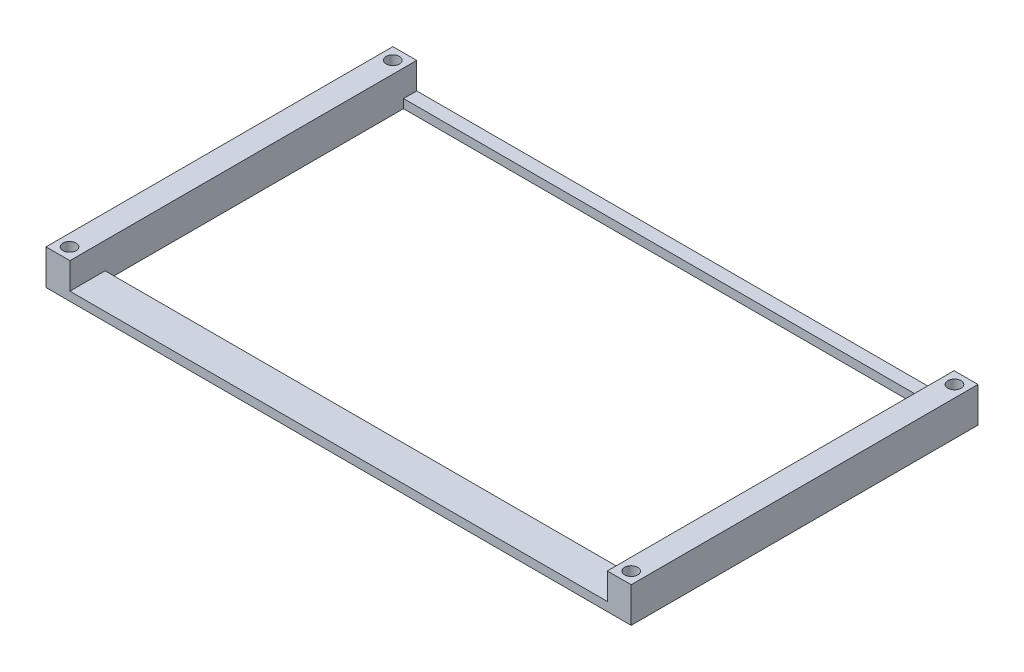
ISO-10303-21;
HEADER;
FILE_DESCRIPTION(('STEP AP214'),'2;1');
FILE_NAME('part.step','',(''),(''),'','','');
FILE_SCHEMA(('AUTOMOTIVE_DESIGN { 1 0 10303 214 1 1 1 1 }'));
ENDSEC;
DATA;
#1=APPLICATION_CONTEXT('core data for automotive mechanical design processes');
#2=APPLICATION_PROTOCOL_DEFINITION('international standard','automotive_design',2000,#1);
#3=PRODUCT_CONTEXT('',#1,'mechanical');
#4=PRODUCT('Part','Part','',(#3));
#5=PRODUCT_RELATED_PRODUCT_CATEGORY('part','',(#4));
#6=PRODUCT_DEFINITION_FORMATION('','',#4);
#7=PRODUCT_DEFINITION_CONTEXT('part definition',#1,'design');
#8=PRODUCT_DEFINITION('design','',#6,#7);
#9=PRODUCT_DEFINITION_SHAPE('','',#8);
#10=(LENGTH_UNIT() NAMED_UNIT(*) SI_UNIT(.MILLI.,.METRE.));
#11=(NAMED_UNIT(*) PLANE_ANGLE_UNIT() SI_UNIT($,.RADIAN.));
#12=(NAMED_UNIT(*) SI_UNIT($,.STERADIAN.) SOLID_ANGLE_UNIT());
#13=UNCERTAINTY_MEASURE_WITH_UNIT(LENGTH_MEASURE(1.E-05),#10,'distance_accuracy_value','');
#14=(GEOMETRIC_REPRESENTATION_CONTEXT(3) GLOBAL_UNCERTAINTY_ASSIGNED_CONTEXT((#13)) GLOBAL_UNIT_ASSIGNED_CONTEXT((#10,
#11,#12)) REPRESENTATION_CONTEXT('',''));
#15=CARTESIAN_POINT('',(0.,0.,0.));
#16=DIRECTION('',(0.,0.,1.));
#17=DIRECTION('',(1.,0.,0.));
#18=AXIS2_PLACEMENT_3D('',#15,#16,#17);
#19=CARTESIAN_POINT('',(0.,2.,0.));
#20=DIRECTION('',(0.,1.,0.));
#21=DIRECTION('',(0.,0.,1.));
#22=AXIS2_PLACEMENT_3D('',#19,#20,#21);
#23=PLANE('',#22);
#24=DIRECTION('',(0.,0.,1.));
#25=VECTOR('',#24,1.);
#26=CARTESIAN_POINT('',(61.,2.,0.));
#27=LINE('',#26,#25);
#28=CARTESIAN_POINT('',(61.,2.,-39.37));
#29=VERTEX_POINT('',#28);
#30=CARTESIAN_POINT('',(61.,2.,-36.37));
#31=VERTEX_POINT('',#30);
#32=EDGE_CURVE('E163',#29,#31,#27,.T.);
#33=ORIENTED_EDGE('',*,*,#32,.F.);
#34=DIRECTION('',(1.,0.,0.));
#35=VECTOR('',#34,1.);
#36=CARTESIAN_POINT('',(0.,2.,-39.37));
#37=LINE('',#36,#35);
#38=CARTESIAN_POINT('',(-61.,2.,-39.37));
#39=VERTEX_POINT('',#38);
#40=EDGE_CURVE('E190',#39,#29,#37,.T.);
#41=ORIENTED_EDGE('',*,*,#40,.F.);
#42=DIRECTION('',(0.,0.,1.));
#43=VECTOR('',#42,1.);
#44=CARTESIAN_POINT('',(-61.,2.,0.));
#45=LINE('',#44,#43);
#46=CARTESIAN_POINT('',(-61.,2.,-36.37));
#47=VERTEX_POINT('',#46);
#48=EDGE_CURVE('E189',#39,#47,#45,.T.);
#49=ORIENTED_EDGE('',*,*,#48,.T.);
#50=DIRECTION('',(1.,0.,0.));
#51=VECTOR('',#50,1.);
#52=CARTESIAN_POINT('',(0.,2.,-36.37));
#53=LINE('',#52,#51);
#54=EDGE_CURVE('E196',#47,#31,#53,.T.);
#55=ORIENTED_EDGE('',*,*,#54,.T.);
#56=EDGE_LOOP('',(#33,#41,#49,#55));
#57=FACE_BOUND('',#56,.T.);
#58=ADVANCED_FACE('F34',(#57),#23,.T.);
#59=CARTESIAN_POINT('',(61.,2.,31.37));
#60=VERTEX_POINT('',#59);
#61=CARTESIAN_POINT('',(61.,2.,39.37));
#62=VERTEX_POINT('',#61);
#63=EDGE_CURVE('E131',#60,#62,#27,.T.);
#64=ORIENTED_EDGE('',*,*,#63,.F.);
#65=DIRECTION('',(1.,0.,0.));
#66=VECTOR('',#65,1.);
#67=CARTESIAN_POINT('',(0.,2.,31.37));
#68=LINE('',#67,#66);
#69=CARTESIAN_POINT('',(-61.,2.,31.37));
#70=VERTEX_POINT('',#69);
#71=EDGE_CURVE('E199',#70,#60,#68,.T.);
#72=ORIENTED_EDGE('',*,*,#71,.F.);
#73=CARTESIAN_POINT('',(-61.,2.,39.37));
#74=VERTEX_POINT('',#73);
#75=EDGE_CURVE('E186',#70,#74,#45,.T.);
#76=ORIENTED_EDGE('',*,*,#75,.T.);
#77=DIRECTION('',(1.,0.,0.));
#78=VECTOR('',#77,1.);
#79=CARTESIAN_POINT('',(0.,2.,39.37));
#80=LINE('',#79,#78);
#81=EDGE_CURVE('E193',#74,#62,#80,.T.);
#82=ORIENTED_EDGE('',*,*,#81,.T.);
#83=EDGE_LOOP('',(#64,#72,#76,#82));
#84=FACE_BOUND('',#83,.T.);
#85=ADVANCED_FACE('F275',(#84),#23,.T.);
#86=CARTESIAN_POINT('',(0.,2.,-36.37));
#87=DIRECTION('',(0.,0.,-1.));
#88=DIRECTION('',(-1.,0.,0.));
#89=AXIS2_PLACEMENT_3D('',#86,#87,#88);
#90=PLANE('',#89);
#91=DIRECTION('',(1.,0.,0.));
#92=VECTOR('',#91,1.);
#93=CARTESIAN_POINT('',(0.,0.,-36.37));
#94=LINE('',#93,#92);
#95=CARTESIAN_POINT('',(-61.,0.,-36.37));
#96=VERTEX_POINT('',#95);
#97=CARTESIAN_POINT('',(61.,0.,-36.37));
#98=VERTEX_POINT('',#97);
#99=EDGE_CURVE('E212',#96,#98,#94,.T.);
#100=ORIENTED_EDGE('',*,*,#99,.T.);
#101=DIRECTION('',(0.,-1.,0.));
#102=VECTOR('',#101,1.);
#103=CARTESIAN_POINT('',(61.,2.,-36.37));
#104=LINE('',#103,#102);
#105=EDGE_CURVE('E11',#31,#98,#104,.T.);
#106=ORIENTED_EDGE('',*,*,#105,.F.);
#107=ORIENTED_EDGE('',*,*,#54,.F.);
#108=DIRECTION('',(0.,-1.,0.));
#109=VECTOR('',#108,1.);
#110=CARTESIAN_POINT('',(-61.,2.,-36.37));
#111=LINE('',#110,#109);
#112=EDGE_CURVE('E233',#47,#96,#111,.T.);
#113=ORIENTED_EDGE('',*,*,#112,.T.);
#114=EDGE_LOOP('',(#100,#106,#107,#113));
#115=FACE_BOUND('',#114,.T.);
#116=ADVANCED_FACE('F268',(#115),#90,.F.);
#117=CARTESIAN_POINT('',(61.,2.,0.));
#118=DIRECTION('',(-1.,0.,0.));
#119=DIRECTION('',(0.,0.,1.));
#120=AXIS2_PLACEMENT_3D('',#117,#118,#119);
#121=PLANE('',#120);
#122=DIRECTION('',(0.,0.,-1.));
#123=VECTOR('',#122,1.);
#124=CARTESIAN_POINT('',(61.,0.,0.));
#125=LINE('',#124,#123);
#126=CARTESIAN_POINT('',(61.,0.,31.37));
#127=VERTEX_POINT('',#126);
#128=EDGE_CURVE('E215',#127,#98,#125,.T.);
#129=ORIENTED_EDGE('',*,*,#128,.F.);
#130=DIRECTION('',(0.,-1.,0.));
#131=VECTOR('',#130,1.);
#132=CARTESIAN_POINT('',(61.,2.,31.37));
#133=LINE('',#132,#131);
#134=EDGE_CURVE('E43',#60,#127,#133,.T.);
#135=ORIENTED_EDGE('',*,*,#134,.F.);
#136=ORIENTED_EDGE('',*,*,#63,.T.);
#137=DIRECTION('',(0.,-1.,0.));
#138=VECTOR('',#137,1.);
#139=CARTESIAN_POINT('',(61.,8.,39.37));
#140=LINE('',#139,#138);
#141=CARTESIAN_POINT('',(61.,8.,39.37));
#142=VERTEX_POINT('',#141);
#143=EDGE_CURVE('E123',#142,#62,#140,.T.);
#144=ORIENTED_EDGE('',*,*,#143,.F.);
#145=DIRECTION('',(0.,0.,-1.));
#146=VECTOR('',#145,1.);
#147=CARTESIAN_POINT('',(61.,8.,0.));
#148=LINE('',#147,#146);
#149=CARTESIAN_POINT('',(61.,8.,-39.37));
#150=VERTEX_POINT('',#149);
#151=EDGE_CURVE('E128',#142,#150,#148,.T.);
#152=ORIENTED_EDGE('',*,*,#151,.T.);
#153=DIRECTION('',(0.,-1.,0.));
#154=VECTOR('',#153,1.);
#155=CARTESIAN_POINT('',(61.,8.,-39.37));
#156=LINE('',#155,#154);
#157=EDGE_CURVE('E135',#150,#29,#156,.T.);
#158=ORIENTED_EDGE('',*,*,#157,.T.);
#159=ORIENTED_EDGE('',*,*,#32,.T.);
#160=ORIENTED_EDGE('',*,*,#105,.T.);
#161=EDGE_LOOP('',(#129,#135,#136,#144,#152,#158,#159,#160));
#162=FACE_BOUND('',#161,.T.);
#163=ADVANCED_FACE('F126',(#162),#121,.T.);
#164=CARTESIAN_POINT('',(0.,2.,31.37));
#165=DIRECTION('',(0.,0.,-1.));
#166=DIRECTION('',(-1.,0.,0.));
#167=AXIS2_PLACEMENT_3D('',#164,#165,#166);
#168=PLANE('',#167);
#169=DIRECTION('',(1.,0.,0.));
#170=VECTOR('',#169,1.);
#171=CARTESIAN_POINT('',(0.,0.,31.37));
#172=LINE('',#171,#170);
#173=CARTESIAN_POINT('',(-61.,0.,31.37));
#174=VERTEX_POINT('',#173);
#175=EDGE_CURVE('E218',#174,#127,#172,.T.);
#176=ORIENTED_EDGE('',*,*,#175,.F.);
#177=DIRECTION('',(0.,-1.,0.));
#178=VECTOR('',#177,1.);
#179=CARTESIAN_POINT('',(-61.,2.,31.37));
#180=LINE('',#179,#178);
#181=EDGE_CURVE('E56',#70,#174,#180,.T.);
#182=ORIENTED_EDGE('',*,*,#181,.F.);
#183=ORIENTED_EDGE('',*,*,#71,.T.);
#184=ORIENTED_EDGE('',*,*,#134,.T.);
#185=EDGE_LOOP('',(#176,#182,#183,#184));
#186=FACE_BOUND('',#185,.T.);
#187=ADVANCED_FACE('F272',(#186),#168,.T.);
#188=CARTESIAN_POINT('',(66.42,2.,0.));
#189=DIRECTION('',(-1.,0.,0.));
#190=DIRECTION('',(0.,0.,1.));
#191=AXIS2_PLACEMENT_3D('',#188,#189,#190);
#192=PLANE('',#191);
#193=DIRECTION('',(0.,0.,-1.));
#194=VECTOR('',#193,1.);
#195=CARTESIAN_POINT('',(66.42,0.,0.));
#196=LINE('',#195,#194);
#197=CARTESIAN_POINT('',(66.42,0.,39.37));
#198=VERTEX_POINT('',#197);
#199=CARTESIAN_POINT('',(66.42,0.,-39.37));
#200=VERTEX_POINT('',#199);
#201=EDGE_CURVE('E202',#198,#200,#196,.T.);
#202=ORIENTED_EDGE('',*,*,#201,.T.);
#203=DIRECTION('',(0.,-1.,0.));
#204=VECTOR('',#203,1.);
#205=CARTESIAN_POINT('',(66.42,2.,-39.37));
#206=LINE('',#205,#204);
#207=CARTESIAN_POINT('',(66.42,8.,-39.37));
#208=VERTEX_POINT('',#207);
#209=EDGE_CURVE('E38',#208,#200,#206,.T.);
#210=ORIENTED_EDGE('',*,*,#209,.F.);
#211=DIRECTION('',(0.,0.,-1.));
#212=VECTOR('',#211,1.);
#213=CARTESIAN_POINT('',(66.42,8.,0.));
#214=LINE('',#213,#212);
#215=CARTESIAN_POINT('',(66.42,8.,39.37));
#216=VERTEX_POINT('',#215);
#217=EDGE_CURVE('E145',#216,#208,#214,.T.);
#218=ORIENTED_EDGE('',*,*,#217,.F.);
#219=DIRECTION('',(0.,-1.,0.));
#220=VECTOR('',#219,1.);
#221=CARTESIAN_POINT('',(66.42,2.,39.37));
#222=LINE('',#221,#220);
#223=EDGE_CURVE('E141',#216,#198,#222,.T.);
#224=ORIENTED_EDGE('',*,*,#223,.T.);
#225=EDGE_LOOP('',(#202,#210,#218,#224));
#226=FACE_BOUND('',#225,.T.);
#227=ADVANCED_FACE('F36',(#226),#192,.F.);
#228=CARTESIAN_POINT('',(0.,2.,-39.37));
#229=DIRECTION('',(0.,0.,-1.));
#230=DIRECTION('',(-1.,0.,0.));
#231=AXIS2_PLACEMENT_3D('',#228,#229,#230);
#232=PLANE('',#231);
#233=ORIENTED_EDGE('',*,*,#40,.T.);
#234=ORIENTED_EDGE('',*,*,#157,.F.);
#235=DIRECTION('',(1.,0.,0.));
#236=VECTOR('',#235,1.);
#237=CARTESIAN_POINT('',(0.,8.,-39.37));
#238=LINE('',#237,#236);
#239=EDGE_CURVE('E150',#150,#208,#238,.T.);
#240=ORIENTED_EDGE('',*,*,#239,.T.);
#241=ORIENTED_EDGE('',*,*,#209,.T.);
#242=DIRECTION('',(1.,0.,0.));
#243=VECTOR('',#242,1.);
#244=CARTESIAN_POINT('',(0.,0.,-39.37));
#245=LINE('',#244,#243);
#246=CARTESIAN_POINT('',(-66.42,0.,-39.37));
#247=VERTEX_POINT('',#246);
#248=EDGE_CURVE('E205',#247,#200,#245,.T.);
#249=ORIENTED_EDGE('',*,*,#248,.F.);
#250=DIRECTION('',(0.,-1.,0.));
#251=VECTOR('',#250,1.);
#252=CARTESIAN_POINT('',(-66.42,2.,-39.37));
#253=LINE('',#252,#251);
#254=CARTESIAN_POINT('',(-66.42,8.,-39.37));
#255=VERTEX_POINT('',#254);
#256=EDGE_CURVE('E239',#255,#247,#253,.T.);
#257=ORIENTED_EDGE('',*,*,#256,.F.);
#258=DIRECTION('',(1.,0.,0.));
#259=VECTOR('',#258,1.);
#260=CARTESIAN_POINT('',(0.,8.,-39.37));
#261=LINE('',#260,#259);
#262=CARTESIAN_POINT('',(-61.,8.,-39.37));
#263=VERTEX_POINT('',#262);
#264=EDGE_CURVE('E169',#255,#263,#261,.T.);
#265=ORIENTED_EDGE('',*,*,#264,.T.);
#266=DIRECTION('',(0.,-1.,0.));
#267=VECTOR('',#266,1.);
#268=CARTESIAN_POINT('',(-61.,8.,-39.37));
#269=LINE('',#268,#267);
#270=EDGE_CURVE('E181',#263,#39,#269,.T.);
#271=ORIENTED_EDGE('',*,*,#270,.T.);
#272=EDGE_LOOP('',(#233,#234,#240,#241,#249,#257,#265,#271));
#273=FACE_BOUND('',#272,.T.);
#274=ADVANCED_FACE('F245',(#273),#232,.T.);
#275=CARTESIAN_POINT('',(-66.42,2.,0.));
#276=DIRECTION('',(-1.,0.,0.));
#277=DIRECTION('',(0.,0.,1.));
#278=AXIS2_PLACEMENT_3D('',#275,#276,#277);
#279=PLANE('',#278);
#280=DIRECTION('',(0.,0.,-1.));
#281=VECTOR('',#280,1.);
#282=CARTESIAN_POINT('',(-66.42,0.,0.));
#283=LINE('',#282,#281);
#284=CARTESIAN_POINT('',(-66.42,0.,39.37));
#285=VERTEX_POINT('',#284);
#286=EDGE_CURVE('E207',#285,#247,#283,.T.);
#287=ORIENTED_EDGE('',*,*,#286,.F.);
#288=DIRECTION('',(0.,-1.,0.));
#289=VECTOR('',#288,1.);
#290=CARTESIAN_POINT('',(-66.42,2.,39.37));
#291=LINE('',#290,#289);
#292=CARTESIAN_POINT('',(-66.42,8.,39.37));
#293=VERTEX_POINT('',#292);
#294=EDGE_CURVE('E238',#293,#285,#291,.T.);
#295=ORIENTED_EDGE('',*,*,#294,.F.);
#296=DIRECTION('',(0.,0.,-1.));
#297=VECTOR('',#296,1.);
#298=CARTESIAN_POINT('',(-66.42,8.,0.));
#299=LINE('',#298,#297);
#300=EDGE_CURVE('E172',#293,#255,#299,.T.);
#301=ORIENTED_EDGE('',*,*,#300,.T.);
#302=ORIENTED_EDGE('',*,*,#256,.T.);
#303=EDGE_LOOP('',(#287,#295,#301,#302));
#304=FACE_BOUND('',#303,.T.);
#305=ADVANCED_FACE('F252',(#304),#279,.T.);
#306=CARTESIAN_POINT('',(63.75,2.,36.7));
#307=DIRECTION('',(0.,-1.,0.));
#308=DIRECTION('',(0.,0.,-1.));
#309=AXIS2_PLACEMENT_3D('',#306,#307,#308);
#310=CYLINDRICAL_SURFACE('',#309,1.50000000000001);
#311=CARTESIAN_POINT('',(63.75,0.,36.7));
#312=DIRECTION('',(0.,1.,0.));
#313=DIRECTION('',(0.,0.,1.));
#314=AXIS2_PLACEMENT_3D('',#311,#312,#313);
#315=CIRCLE('',#314,1.50000000000001);
#316=CARTESIAN_POINT('',(63.75,0.,38.2));
#317=VERTEX_POINT('',#316);
#318=EDGE_CURVE('E228',#317,#317,#315,.T.);
#319=ORIENTED_EDGE('',*,*,#318,.F.);
#320=EDGE_LOOP('',(#319));
#321=FACE_BOUND('',#320,.T.);
#322=CARTESIAN_POINT('',(63.75,8.,36.7));
#323=DIRECTION('',(0.,1.,0.));
#324=DIRECTION('',(0.,0.,1.));
#325=AXIS2_PLACEMENT_3D('',#322,#323,#324);
#326=CIRCLE('',#325,1.50000000000001);
#327=CARTESIAN_POINT('',(63.75,8.,38.2));
#328=VERTEX_POINT('',#327);
#329=EDGE_CURVE('E151',#328,#328,#326,.T.);
#330=ORIENTED_EDGE('',*,*,#329,.T.);
#331=EDGE_LOOP('',(#330));
#332=FACE_BOUND('',#331,.T.);
#333=ADVANCED_FACE('F303',(#321,#332),#310,.F.);
#334=CARTESIAN_POINT('',(-63.75,2.,36.7));
#335=DIRECTION('',(0.,-1.,0.));
#336=DIRECTION('',(0.,0.,-1.));
#337=AXIS2_PLACEMENT_3D('',#334,#335,#336);
#338=CYLINDRICAL_SURFACE('',#337,1.50000000000001);
#339=CARTESIAN_POINT('',(-63.75,0.,36.7));
#340=DIRECTION('',(0.,1.,0.));
#341=DIRECTION('',(0.,0.,1.));
#342=AXIS2_PLACEMENT_3D('',#339,#340,#341);
#343=CIRCLE('',#342,1.50000000000001);
#344=CARTESIAN_POINT('',(-63.75,0.,38.2));
#345=VERTEX_POINT('',#344);
#346=EDGE_CURVE('E225',#345,#345,#343,.F.);
#347=ORIENTED_EDGE('',*,*,#346,.T.);
#348=EDGE_LOOP('',(#347));
#349=FACE_BOUND('',#348,.T.);
#350=CARTESIAN_POINT('',(-63.75,8.,36.7));
#351=DIRECTION('',(0.,1.,0.));
#352=DIRECTION('',(0.,0.,1.));
#353=AXIS2_PLACEMENT_3D('',#350,#351,#352);
#354=CIRCLE('',#353,1.50000000000001);
#355=CARTESIAN_POINT('',(-63.75,8.,38.2));
#356=VERTEX_POINT('',#355);
#357=EDGE_CURVE('E178',#356,#356,#354,.F.);
#358=ORIENTED_EDGE('',*,*,#357,.F.);
#359=EDGE_LOOP('',(#358));
#360=FACE_BOUND('',#359,.T.);
#361=ADVANCED_FACE('F286',(#349,#360),#338,.F.);
#362=CARTESIAN_POINT('',(-63.75,2.,-36.7));
#363=DIRECTION('',(0.,-1.,0.));
#364=DIRECTION('',(0.,0.,-1.));
#365=AXIS2_PLACEMENT_3D('',#362,#363,#364);
#366=CYLINDRICAL_SURFACE('',#365,1.50000000000002);
#367=CARTESIAN_POINT('',(-63.75,0.,-36.7));
#368=DIRECTION('',(0.,1.,0.));
#369=DIRECTION('',(0.,0.,1.));
#370=AXIS2_PLACEMENT_3D('',#367,#368,#369);
#371=CIRCLE('',#370,1.50000000000002);
#372=CARTESIAN_POINT('',(-63.75,0.,-35.2));
#373=VERTEX_POINT('',#372);
#374=EDGE_CURVE('E222',#373,#373,#371,.T.);
#375=ORIENTED_EDGE('',*,*,#374,.F.);
#376=EDGE_LOOP('',(#375));
#377=FACE_BOUND('',#376,.T.);
#378=CARTESIAN_POINT('',(-63.75,8.,-36.7));
#379=DIRECTION('',(0.,1.,0.));
#380=DIRECTION('',(0.,0.,1.));
#381=AXIS2_PLACEMENT_3D('',#378,#379,#380);
#382=CIRCLE('',#381,1.50000000000002);
#383=CARTESIAN_POINT('',(-63.75,8.,-35.2));
#384=VERTEX_POINT('',#383);
#385=EDGE_CURVE('E175',#384,#384,#382,.T.);
#386=ORIENTED_EDGE('',*,*,#385,.T.);
#387=EDGE_LOOP('',(#386));
#388=FACE_BOUND('',#387,.T.);
#389=ADVANCED_FACE('F278',(#377,#388),#366,.F.);
#390=CARTESIAN_POINT('',(-61.,2.,0.));
#391=DIRECTION('',(-1.,0.,0.));
#392=DIRECTION('',(0.,0.,1.));
#393=AXIS2_PLACEMENT_3D('',#390,#391,#392);
#394=PLANE('',#393);
#395=DIRECTION('',(0.,0.,-1.));
#396=VECTOR('',#395,1.);
#397=CARTESIAN_POINT('',(-61.,0.,0.));
#398=LINE('',#397,#396);
#399=EDGE_CURVE('E51',#174,#96,#398,.T.);
#400=ORIENTED_EDGE('',*,*,#399,.T.);
#401=ORIENTED_EDGE('',*,*,#112,.F.);
#402=ORIENTED_EDGE('',*,*,#48,.F.);
#403=ORIENTED_EDGE('',*,*,#270,.F.);
#404=DIRECTION('',(0.,0.,-1.));
#405=VECTOR('',#404,1.);
#406=CARTESIAN_POINT('',(-61.,8.,0.));
#407=LINE('',#406,#405);
#408=CARTESIAN_POINT('',(-61.,8.,39.37));
#409=VERTEX_POINT('',#408);
#410=EDGE_CURVE('E167',#409,#263,#407,.T.);
#411=ORIENTED_EDGE('',*,*,#410,.F.);
#412=DIRECTION('',(0.,-1.,0.));
#413=VECTOR('',#412,1.);
#414=CARTESIAN_POINT('',(-61.,8.,39.37));
#415=LINE('',#414,#413);
#416=EDGE_CURVE('E184',#409,#74,#415,.T.);
#417=ORIENTED_EDGE('',*,*,#416,.T.);
#418=ORIENTED_EDGE('',*,*,#75,.F.);
#419=ORIENTED_EDGE('',*,*,#181,.T.);
#420=EDGE_LOOP('',(#400,#401,#402,#403,#411,#417,#418,#419));
#421=FACE_BOUND('',#420,.T.);
#422=ADVANCED_FACE('F276',(#421),#394,.F.);
#423=CARTESIAN_POINT('',(0.,2.,39.37));
#424=DIRECTION('',(0.,0.,-1.));
#425=DIRECTION('',(-1.,0.,0.));
#426=AXIS2_PLACEMENT_3D('',#423,#424,#425);
#427=PLANE('',#426);
#428=DIRECTION('',(1.,0.,0.));
#429=VECTOR('',#428,1.);
#430=CARTESIAN_POINT('',(0.,0.,39.37));
#431=LINE('',#430,#429);
#432=EDGE_CURVE('E210',#285,#198,#431,.T.);
#433=ORIENTED_EDGE('',*,*,#432,.T.);
#434=ORIENTED_EDGE('',*,*,#223,.F.);
#435=DIRECTION('',(1.,0.,0.));
#436=VECTOR('',#435,1.);
#437=CARTESIAN_POINT('',(0.,8.,39.37));
#438=LINE('',#437,#436);
#439=EDGE_CURVE('E138',#142,#216,#438,.T.);
#440=ORIENTED_EDGE('',*,*,#439,.F.);
#441=ORIENTED_EDGE('',*,*,#143,.T.);
#442=ORIENTED_EDGE('',*,*,#81,.F.);
#443=ORIENTED_EDGE('',*,*,#416,.F.);
#444=DIRECTION('',(1.,0.,0.));
#445=VECTOR('',#444,1.);
#446=CARTESIAN_POINT('',(0.,8.,39.37));
#447=LINE('',#446,#445);
#448=EDGE_CURVE('E164',#293,#409,#447,.T.);
#449=ORIENTED_EDGE('',*,*,#448,.F.);
#450=ORIENTED_EDGE('',*,*,#294,.T.);
#451=EDGE_LOOP('',(#433,#434,#440,#441,#442,#443,#449,#450));
#452=FACE_BOUND('',#451,.T.);
#453=ADVANCED_FACE('F139',(#452),#427,.F.);
#454=CARTESIAN_POINT('',(63.75,2.,-36.7));
#455=DIRECTION('',(0.,-1.,0.));
#456=DIRECTION('',(0.,0.,-1.));
#457=AXIS2_PLACEMENT_3D('',#454,#455,#456);
#458=CYLINDRICAL_SURFACE('',#457,1.50000000000001);
#459=CARTESIAN_POINT('',(63.75,0.,-36.7));
#460=DIRECTION('',(0.,1.,0.));
#461=DIRECTION('',(0.,0.,1.));
#462=AXIS2_PLACEMENT_3D('',#459,#460,#461);
#463=CIRCLE('',#462,1.50000000000001);
#464=CARTESIAN_POINT('',(63.75,0.,-35.2));
#465=VERTEX_POINT('',#464);
#466=EDGE_CURVE('E194',#465,#465,#463,.F.);
#467=ORIENTED_EDGE('',*,*,#466,.T.);
#468=EDGE_LOOP('',(#467));
#469=FACE_BOUND('',#468,.T.);
#470=CARTESIAN_POINT('',(63.75,8.,-36.7));
#471=DIRECTION('',(0.,1.,0.));
#472=DIRECTION('',(0.,0.,1.));
#473=AXIS2_PLACEMENT_3D('',#470,#471,#472);
#474=CIRCLE('',#473,1.50000000000001);
#475=CARTESIAN_POINT('',(63.75,8.,-35.2));
#476=VERTEX_POINT('',#475);
#477=EDGE_CURVE('E158',#476,#476,#474,.F.);
#478=ORIENTED_EDGE('',*,*,#477,.F.);
#479=EDGE_LOOP('',(#478));
#480=FACE_BOUND('',#479,.T.);
#481=ADVANCED_FACE('F284',(#469,#480),#458,.F.);
#482=CARTESIAN_POINT('',(0.,0.,0.));
#483=DIRECTION('',(0.,1.,0.));
#484=DIRECTION('',(0.,0.,1.));
#485=AXIS2_PLACEMENT_3D('',#482,#483,#484);
#486=PLANE('',#485);
#487=ORIENTED_EDGE('',*,*,#128,.T.);
#488=ORIENTED_EDGE('',*,*,#99,.F.);
#489=ORIENTED_EDGE('',*,*,#399,.F.);
#490=ORIENTED_EDGE('',*,*,#175,.T.);
#491=EDGE_LOOP('',(#487,#488,#489,#490));
#492=FACE_BOUND('',#491,.T.);
#493=ORIENTED_EDGE('',*,*,#248,.T.);
#494=ORIENTED_EDGE('',*,*,#201,.F.);
#495=ORIENTED_EDGE('',*,*,#432,.F.);
#496=ORIENTED_EDGE('',*,*,#286,.T.);
#497=EDGE_LOOP('',(#493,#494,#495,#496));
#498=FACE_BOUND('',#497,.T.);
#499=ORIENTED_EDGE('',*,*,#374,.T.);
#500=EDGE_LOOP('',(#499));
#501=FACE_BOUND('',#500,.T.);
#502=ORIENTED_EDGE('',*,*,#346,.F.);
#503=EDGE_LOOP('',(#502));
#504=FACE_BOUND('',#503,.T.);
#505=ORIENTED_EDGE('',*,*,#318,.T.);
#506=EDGE_LOOP('',(#505));
#507=FACE_BOUND('',#506,.T.);
#508=ORIENTED_EDGE('',*,*,#466,.F.);
#509=EDGE_LOOP('',(#508));
#510=FACE_BOUND('',#509,.T.);
#511=ADVANCED_FACE('F250',(#492,#498,#501,#504,#507,#510),#486,.F.);
#512=CARTESIAN_POINT('',(0.,8.,0.));
#513=DIRECTION('',(0.,1.,0.));
#514=DIRECTION('',(0.,0.,1.));
#515=AXIS2_PLACEMENT_3D('',#512,#513,#514);
#516=PLANE('',#515);
#517=ORIENTED_EDGE('',*,*,#448,.T.);
#518=ORIENTED_EDGE('',*,*,#410,.T.);
#519=ORIENTED_EDGE('',*,*,#264,.F.);
#520=ORIENTED_EDGE('',*,*,#300,.F.);
#521=EDGE_LOOP('',(#517,#518,#519,#520));
#522=FACE_BOUND('',#521,.T.);
#523=ORIENTED_EDGE('',*,*,#385,.F.);
#524=EDGE_LOOP('',(#523));
#525=FACE_BOUND('',#524,.T.);
#526=ORIENTED_EDGE('',*,*,#357,.T.);
#527=EDGE_LOOP('',(#526));
#528=FACE_BOUND('',#527,.T.);
#529=ADVANCED_FACE('F258',(#522,#525,#528),#516,.T.);
#530=CARTESIAN_POINT('',(0.,8.,0.));
#531=DIRECTION('',(0.,1.,0.));
#532=DIRECTION('',(0.,0.,1.));
#533=AXIS2_PLACEMENT_3D('',#530,#531,#532);
#534=PLANE('',#533);
#535=ORIENTED_EDGE('',*,*,#329,.F.);
#536=EDGE_LOOP('',(#535));
#537=FACE_BOUND('',#536,.T.);
#538=ORIENTED_EDGE('',*,*,#151,.F.);
#539=ORIENTED_EDGE('',*,*,#439,.T.);
#540=ORIENTED_EDGE('',*,*,#217,.T.);
#541=ORIENTED_EDGE('',*,*,#239,.F.);
#542=EDGE_LOOP('',(#538,#539,#540,#541));
#543=FACE_BOUND('',#542,.T.);
#544=ORIENTED_EDGE('',*,*,#477,.T.);
#545=EDGE_LOOP('',(#544));
#546=FACE_BOUND('',#545,.T.);
#547=ADVANCED_FACE('F147',(#537,#543,#546),#534,.T.);
#548=CLOSED_SHELL('',(#58,#85,#116,#163,#187,#227,#274,#305,#333,#361,#389,#422,#453,#481,#511,
#529,#547));
#549=MANIFOLD_SOLID_BREP('B2',#548);
#550=ADVANCED_BREP_SHAPE_REPRESENTATION('',(#18,#549),#14);
#551=SHAPE_DEFINITION_REPRESENTATION(#9,#550);
ENDSEC;
END-ISO-10303-21;
